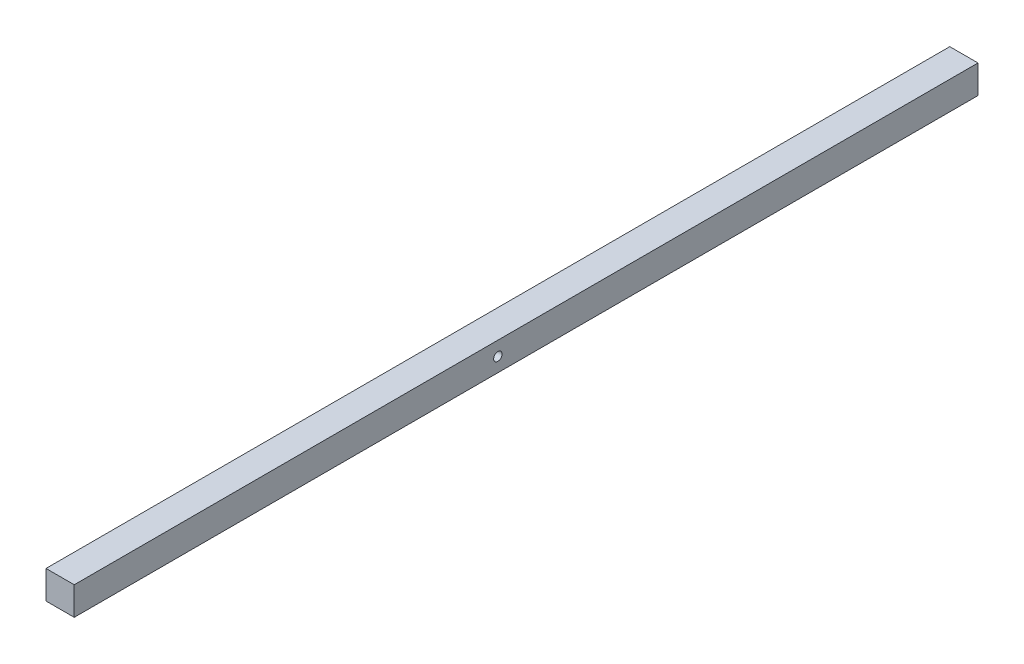
ISO-10303-21;
HEADER;
FILE_DESCRIPTION(('STEP AP214'),'2;1');
FILE_NAME('part.step','',(''),(''),'','','');
FILE_SCHEMA(('AUTOMOTIVE_DESIGN { 1 0 10303 214 1 1 1 1 }'));
ENDSEC;
DATA;
#1=APPLICATION_CONTEXT('core data for automotive mechanical design processes');
#2=APPLICATION_PROTOCOL_DEFINITION('international standard','automotive_design',2000,#1);
#3=PRODUCT_CONTEXT('',#1,'mechanical');
#4=PRODUCT('Part','Part','',(#3));
#5=PRODUCT_RELATED_PRODUCT_CATEGORY('part','',(#4));
#6=PRODUCT_DEFINITION_FORMATION('','',#4);
#7=PRODUCT_DEFINITION_CONTEXT('part definition',#1,'design');
#8=PRODUCT_DEFINITION('design','',#6,#7);
#9=PRODUCT_DEFINITION_SHAPE('','',#8);
#10=(LENGTH_UNIT() NAMED_UNIT(*) SI_UNIT(.MILLI.,.METRE.));
#11=(NAMED_UNIT(*) PLANE_ANGLE_UNIT() SI_UNIT($,.RADIAN.));
#12=(NAMED_UNIT(*) SI_UNIT($,.STERADIAN.) SOLID_ANGLE_UNIT());
#13=UNCERTAINTY_MEASURE_WITH_UNIT(LENGTH_MEASURE(1.E-05),#10,'distance_accuracy_value','');
#14=(GEOMETRIC_REPRESENTATION_CONTEXT(3) GLOBAL_UNCERTAINTY_ASSIGNED_CONTEXT((#13)) GLOBAL_UNIT_ASSIGNED_CONTEXT((#10,
#11,#12)) REPRESENTATION_CONTEXT('',''));
#15=CARTESIAN_POINT('',(0.,0.,0.));
#16=DIRECTION('',(0.,0.,1.));
#17=DIRECTION('',(1.,0.,0.));
#18=AXIS2_PLACEMENT_3D('',#15,#16,#17);
#19=CARTESIAN_POINT('',(0.,0.,640.));
#20=DIRECTION('',(1.,0.,0.));
#21=DIRECTION('',(0.,0.,-1.));
#22=AXIS2_PLACEMENT_3D('',#19,#20,#21);
#23=PLANE('',#22);
#24=DIRECTION('',(0.,-1.,0.));
#25=VECTOR('',#24,1.);
#26=CARTESIAN_POINT('',(0.,0.,0.));
#27=LINE('',#26,#25);
#28=CARTESIAN_POINT('',(0.,20.,0.));
#29=VERTEX_POINT('',#28);
#30=CARTESIAN_POINT('',(0.,0.,0.));
#31=VERTEX_POINT('',#30);
#32=EDGE_CURVE('E101',#29,#31,#27,.T.);
#33=ORIENTED_EDGE('',*,*,#32,.T.);
#34=DIRECTION('',(0.,0.,-1.));
#35=VECTOR('',#34,1.);
#36=CARTESIAN_POINT('',(0.,0.,640.));
#37=LINE('',#36,#35);
#38=CARTESIAN_POINT('',(0.,0.,640.));
#39=VERTEX_POINT('',#38);
#40=EDGE_CURVE('E11',#39,#31,#37,.T.);
#41=ORIENTED_EDGE('',*,*,#40,.F.);
#42=DIRECTION('',(0.,-1.,0.));
#43=VECTOR('',#42,1.);
#44=CARTESIAN_POINT('',(0.,0.,640.));
#45=LINE('',#44,#43);
#46=CARTESIAN_POINT('',(0.,20.,640.));
#47=VERTEX_POINT('',#46);
#48=EDGE_CURVE('E89',#47,#39,#45,.T.);
#49=ORIENTED_EDGE('',*,*,#48,.F.);
#50=DIRECTION('',(0.,0.,-1.));
#51=VECTOR('',#50,1.);
#52=CARTESIAN_POINT('',(0.,20.,640.));
#53=LINE('',#52,#51);
#54=EDGE_CURVE('E97',#47,#29,#53,.T.);
#55=ORIENTED_EDGE('',*,*,#54,.T.);
#56=EDGE_LOOP('',(#33,#41,#49,#55));
#57=FACE_BOUND('',#56,.T.);
#58=ADVANCED_FACE('F38',(#57),#23,.F.);
#59=CARTESIAN_POINT('',(0.,0.,640.));
#60=DIRECTION('',(0.,1.,0.));
#61=DIRECTION('',(0.,0.,1.));
#62=AXIS2_PLACEMENT_3D('',#59,#60,#61);
#63=PLANE('',#62);
#64=DIRECTION('',(1.,0.,0.));
#65=VECTOR('',#64,1.);
#66=CARTESIAN_POINT('',(0.,0.,0.));
#67=LINE('',#66,#65);
#68=CARTESIAN_POINT('',(20.,0.,0.));
#69=VERTEX_POINT('',#68);
#70=EDGE_CURVE('E93',#31,#69,#67,.T.);
#71=ORIENTED_EDGE('',*,*,#70,.T.);
#72=DIRECTION('',(0.,0.,-1.));
#73=VECTOR('',#72,1.);
#74=CARTESIAN_POINT('',(20.,0.,640.));
#75=LINE('',#74,#73);
#76=CARTESIAN_POINT('',(20.,0.,640.));
#77=VERTEX_POINT('',#76);
#78=EDGE_CURVE('E46',#77,#69,#75,.T.);
#79=ORIENTED_EDGE('',*,*,#78,.F.);
#80=DIRECTION('',(1.,0.,0.));
#81=VECTOR('',#80,1.);
#82=CARTESIAN_POINT('',(0.,0.,640.));
#83=LINE('',#82,#81);
#84=EDGE_CURVE('E84',#39,#77,#83,.T.);
#85=ORIENTED_EDGE('',*,*,#84,.F.);
#86=ORIENTED_EDGE('',*,*,#40,.T.);
#87=EDGE_LOOP('',(#71,#79,#85,#86));
#88=FACE_BOUND('',#87,.T.);
#89=ADVANCED_FACE('F92',(#88),#63,.F.);
#90=CARTESIAN_POINT('',(20.,0.,640.));
#91=DIRECTION('',(-1.,0.,0.));
#92=DIRECTION('',(0.,0.,1.));
#93=AXIS2_PLACEMENT_3D('',#90,#91,#92);
#94=PLANE('',#93);
#95=CARTESIAN_POINT('',(20.,10.,340.));
#96=DIRECTION('',(1.,0.,0.));
#97=DIRECTION('',(0.,0.,-1.));
#98=AXIS2_PLACEMENT_3D('',#95,#96,#97);
#99=CIRCLE('',#98,2.99999999999999);
#100=CARTESIAN_POINT('',(20.,10.,337.));
#101=VERTEX_POINT('',#100);
#102=EDGE_CURVE('E115',#101,#101,#99,.T.);
#103=ORIENTED_EDGE('',*,*,#102,.F.);
#104=EDGE_LOOP('',(#103));
#105=FACE_BOUND('',#104,.T.);
#106=DIRECTION('',(0.,1.,0.));
#107=VECTOR('',#106,1.);
#108=CARTESIAN_POINT('',(20.,0.,0.));
#109=LINE('',#108,#107);
#110=CARTESIAN_POINT('',(20.,20.,0.));
#111=VERTEX_POINT('',#110);
#112=EDGE_CURVE('E71',#69,#111,#109,.T.);
#113=ORIENTED_EDGE('',*,*,#112,.T.);
#114=DIRECTION('',(0.,0.,-1.));
#115=VECTOR('',#114,1.);
#116=CARTESIAN_POINT('',(20.,20.,640.));
#117=LINE('',#116,#115);
#118=CARTESIAN_POINT('',(20.,20.,640.));
#119=VERTEX_POINT('',#118);
#120=EDGE_CURVE('E94',#119,#111,#117,.T.);
#121=ORIENTED_EDGE('',*,*,#120,.F.);
#122=DIRECTION('',(0.,1.,0.));
#123=VECTOR('',#122,1.);
#124=CARTESIAN_POINT('',(20.,0.,640.));
#125=LINE('',#124,#123);
#126=EDGE_CURVE('E87',#77,#119,#125,.T.);
#127=ORIENTED_EDGE('',*,*,#126,.F.);
#128=ORIENTED_EDGE('',*,*,#78,.T.);
#129=EDGE_LOOP('',(#113,#121,#127,#128));
#130=FACE_BOUND('',#129,.T.);
#131=ADVANCED_FACE('F95',(#105,#130),#94,.F.);
#132=CARTESIAN_POINT('',(0.,20.,640.));
#133=DIRECTION('',(0.,-1.,0.));
#134=DIRECTION('',(0.,0.,-1.));
#135=AXIS2_PLACEMENT_3D('',#132,#133,#134);
#136=PLANE('',#135);
#137=DIRECTION('',(-1.,0.,0.));
#138=VECTOR('',#137,1.);
#139=CARTESIAN_POINT('',(0.,20.,0.));
#140=LINE('',#139,#138);
#141=EDGE_CURVE('E77',#111,#29,#140,.T.);
#142=ORIENTED_EDGE('',*,*,#141,.T.);
#143=ORIENTED_EDGE('',*,*,#54,.F.);
#144=DIRECTION('',(-1.,0.,0.));
#145=VECTOR('',#144,1.);
#146=CARTESIAN_POINT('',(0.,20.,640.));
#147=LINE('',#146,#145);
#148=EDGE_CURVE('E54',#119,#47,#147,.T.);
#149=ORIENTED_EDGE('',*,*,#148,.F.);
#150=ORIENTED_EDGE('',*,*,#120,.T.);
#151=EDGE_LOOP('',(#142,#143,#149,#150));
#152=FACE_BOUND('',#151,.T.);
#153=ADVANCED_FACE('F109',(#152),#136,.F.);
#154=CARTESIAN_POINT('',(0.,0.,640.));
#155=DIRECTION('',(0.,0.,-1.));
#156=DIRECTION('',(-1.,0.,0.));
#157=AXIS2_PLACEMENT_3D('',#154,#155,#156);
#158=PLANE('',#157);
#159=ORIENTED_EDGE('',*,*,#48,.T.);
#160=ORIENTED_EDGE('',*,*,#84,.T.);
#161=ORIENTED_EDGE('',*,*,#126,.T.);
#162=ORIENTED_EDGE('',*,*,#148,.T.);
#163=EDGE_LOOP('',(#159,#160,#161,#162));
#164=FACE_BOUND('',#163,.T.);
#165=ADVANCED_FACE('F85',(#164),#158,.F.);
#166=CARTESIAN_POINT('',(0.,0.,0.));
#167=DIRECTION('',(0.,0.,-1.));
#168=DIRECTION('',(-1.,0.,0.));
#169=AXIS2_PLACEMENT_3D('',#166,#167,#168);
#170=PLANE('',#169);
#171=ORIENTED_EDGE('',*,*,#32,.F.);
#172=ORIENTED_EDGE('',*,*,#141,.F.);
#173=ORIENTED_EDGE('',*,*,#112,.F.);
#174=ORIENTED_EDGE('',*,*,#70,.F.);
#175=EDGE_LOOP('',(#171,#172,#173,#174));
#176=FACE_BOUND('',#175,.T.);
#177=ADVANCED_FACE('F112',(#176),#170,.T.);
#178=CARTESIAN_POINT('',(12.,10.,340.));
#179=DIRECTION('',(1.,0.,0.));
#180=DIRECTION('',(0.,0.,-1.));
#181=AXIS2_PLACEMENT_3D('',#178,#179,#180);
#182=CYLINDRICAL_SURFACE('',#181,2.99999999999999);
#183=CARTESIAN_POINT('',(12.,10.,340.));
#184=DIRECTION('',(1.,0.,0.));
#185=DIRECTION('',(0.,0.,-1.));
#186=AXIS2_PLACEMENT_3D('',#183,#184,#185);
#187=CIRCLE('',#186,2.99999999999999);
#188=CARTESIAN_POINT('',(12.,10.,337.));
#189=VERTEX_POINT('',#188);
#190=EDGE_CURVE('E104',#189,#189,#187,.T.);
#191=ORIENTED_EDGE('',*,*,#190,.F.);
#192=EDGE_LOOP('',(#191));
#193=FACE_BOUND('',#192,.T.);
#194=ORIENTED_EDGE('',*,*,#102,.T.);
#195=EDGE_LOOP('',(#194));
#196=FACE_BOUND('',#195,.T.);
#197=ADVANCED_FACE('F123',(#193,#196),#182,.F.);
#198=CARTESIAN_POINT('',(12.,10.,340.));
#199=DIRECTION('',(1.,0.,0.));
#200=DIRECTION('',(0.,0.,-1.));
#201=AXIS2_PLACEMENT_3D('',#198,#199,#200);
#202=PLANE('',#201);
#203=ORIENTED_EDGE('',*,*,#190,.T.);
#204=EDGE_LOOP('',(#203));
#205=FACE_BOUND('',#204,.T.);
#206=ADVANCED_FACE('F121',(#205),#202,.T.);
#207=CLOSED_SHELL('',(#58,#89,#131,#153,#165,#177,#197,#206));
#208=MANIFOLD_SOLID_BREP('B2',#207);
#209=ADVANCED_BREP_SHAPE_REPRESENTATION('',(#18,#208),#14);
#210=SHAPE_DEFINITION_REPRESENTATION(#9,#209);
ENDSEC;
END-ISO-10303-21;
